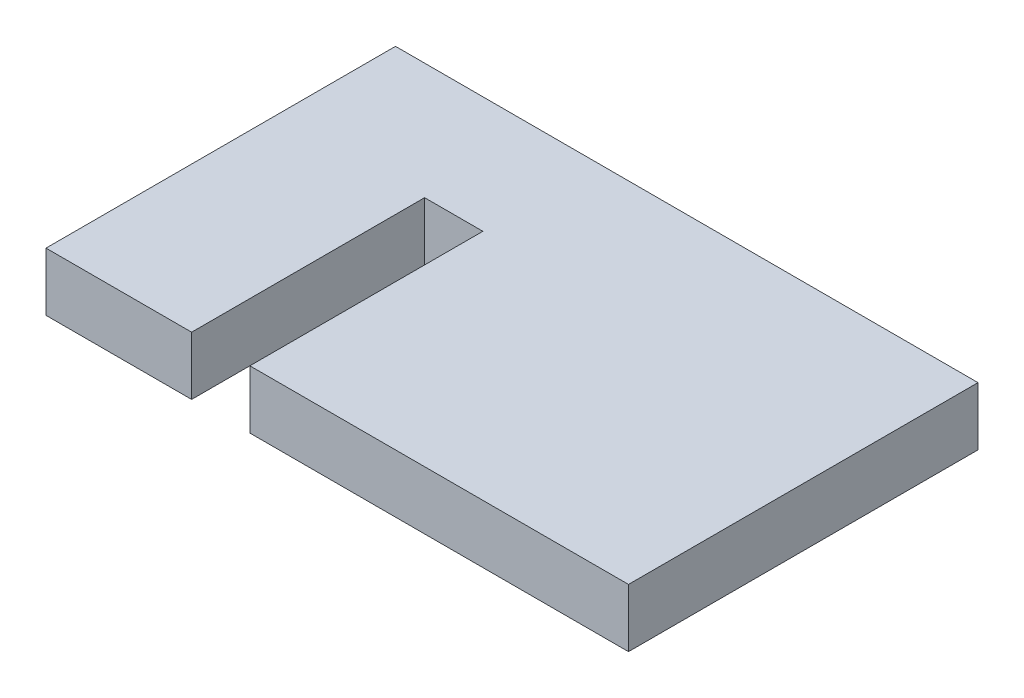
ISO-10303-21;
HEADER;
FILE_DESCRIPTION(('STEP AP214'),'2;1');
FILE_NAME('part.step','',(''),(''),'','','');
FILE_SCHEMA(('AUTOMOTIVE_DESIGN { 1 0 10303 214 1 1 1 1 }'));
ENDSEC;
DATA;
#1=APPLICATION_CONTEXT('core data for automotive mechanical design processes');
#2=APPLICATION_PROTOCOL_DEFINITION('international standard','automotive_design',2000,#1);
#3=PRODUCT_CONTEXT('',#1,'mechanical');
#4=PRODUCT('Part','Part','',(#3));
#5=PRODUCT_RELATED_PRODUCT_CATEGORY('part','',(#4));
#6=PRODUCT_DEFINITION_FORMATION('','',#4);
#7=PRODUCT_DEFINITION_CONTEXT('part definition',#1,'design');
#8=PRODUCT_DEFINITION('design','',#6,#7);
#9=PRODUCT_DEFINITION_SHAPE('','',#8);
#10=(LENGTH_UNIT() NAMED_UNIT(*) SI_UNIT(.MILLI.,.METRE.));
#11=(NAMED_UNIT(*) PLANE_ANGLE_UNIT() SI_UNIT($,.RADIAN.));
#12=(NAMED_UNIT(*) SI_UNIT($,.STERADIAN.) SOLID_ANGLE_UNIT());
#13=UNCERTAINTY_MEASURE_WITH_UNIT(LENGTH_MEASURE(1.E-05),#10,'distance_accuracy_value','');
#14=(GEOMETRIC_REPRESENTATION_CONTEXT(3) GLOBAL_UNCERTAINTY_ASSIGNED_CONTEXT((#13)) GLOBAL_UNIT_ASSIGNED_CONTEXT((#10,
#11,#12)) REPRESENTATION_CONTEXT('',''));
#15=CARTESIAN_POINT('',(0.,0.,0.));
#16=DIRECTION('',(0.,0.,1.));
#17=DIRECTION('',(1.,0.,0.));
#18=AXIS2_PLACEMENT_3D('',#15,#16,#17);
#19=CARTESIAN_POINT('',(0.,6.35,0.));
#20=DIRECTION('',(0.,0.,-1.));
#21=DIRECTION('',(-1.,0.,0.));
#22=AXIS2_PLACEMENT_3D('',#19,#20,#21);
#23=PLANE('',#22);
#24=DIRECTION('',(1.,0.,0.));
#25=VECTOR('',#24,1.);
#26=CARTESIAN_POINT('',(0.,0.,0.));
#27=LINE('',#26,#25);
#28=CARTESIAN_POINT('',(0.,0.,0.));
#29=VERTEX_POINT('',#28);
#30=CARTESIAN_POINT('',(15.875,0.,0.));
#31=VERTEX_POINT('',#30);
#32=EDGE_CURVE('E171',#29,#31,#27,.T.);
#33=ORIENTED_EDGE('',*,*,#32,.T.);
#34=DIRECTION('',(0.,-1.,0.));
#35=VECTOR('',#34,1.);
#36=CARTESIAN_POINT('',(15.875,6.35,0.));
#37=LINE('',#36,#35);
#38=CARTESIAN_POINT('',(15.875,6.35,0.));
#39=VERTEX_POINT('',#38);
#40=EDGE_CURVE('E145',#39,#31,#37,.T.);
#41=ORIENTED_EDGE('',*,*,#40,.F.);
#42=DIRECTION('',(1.,0.,0.));
#43=VECTOR('',#42,1.);
#44=CARTESIAN_POINT('',(0.,6.35,0.));
#45=LINE('',#44,#43);
#46=CARTESIAN_POINT('',(0.,6.35,0.));
#47=VERTEX_POINT('',#46);
#48=EDGE_CURVE('E92',#47,#39,#45,.T.);
#49=ORIENTED_EDGE('',*,*,#48,.F.);
#50=DIRECTION('',(0.,-1.,0.));
#51=VECTOR('',#50,1.);
#52=CARTESIAN_POINT('',(0.,6.35,0.));
#53=LINE('',#52,#51);
#54=EDGE_CURVE('E11',#47,#29,#53,.T.);
#55=ORIENTED_EDGE('',*,*,#54,.T.);
#56=EDGE_LOOP('',(#33,#41,#49,#55));
#57=FACE_BOUND('',#56,.T.);
#58=ADVANCED_FACE('F39',(#57),#23,.F.);
#59=CARTESIAN_POINT('',(0.,6.35,0.));
#60=DIRECTION('',(1.,0.,0.));
#61=DIRECTION('',(0.,0.,-1.));
#62=AXIS2_PLACEMENT_3D('',#59,#60,#61);
#63=PLANE('',#62);
#64=DIRECTION('',(0.,0.,1.));
#65=VECTOR('',#64,1.);
#66=CARTESIAN_POINT('',(0.,0.,0.));
#67=LINE('',#66,#65);
#68=CARTESIAN_POINT('',(0.,0.,-38.1));
#69=VERTEX_POINT('',#68);
#70=EDGE_CURVE('E148',#69,#29,#67,.T.);
#71=ORIENTED_EDGE('',*,*,#70,.T.);
#72=ORIENTED_EDGE('',*,*,#54,.F.);
#73=DIRECTION('',(0.,0.,1.));
#74=VECTOR('',#73,1.);
#75=CARTESIAN_POINT('',(0.,6.35,0.));
#76=LINE('',#75,#74);
#77=CARTESIAN_POINT('',(0.,6.35,-38.1));
#78=VERTEX_POINT('',#77);
#79=EDGE_CURVE('E155',#78,#47,#76,.T.);
#80=ORIENTED_EDGE('',*,*,#79,.F.);
#81=DIRECTION('',(0.,-1.,0.));
#82=VECTOR('',#81,1.);
#83=CARTESIAN_POINT('',(0.,6.35,-38.1));
#84=LINE('',#83,#82);
#85=EDGE_CURVE('E166',#78,#69,#84,.T.);
#86=ORIENTED_EDGE('',*,*,#85,.T.);
#87=EDGE_LOOP('',(#71,#72,#80,#86));
#88=FACE_BOUND('',#87,.T.);
#89=ADVANCED_FACE('F41',(#88),#63,.F.);
#90=CARTESIAN_POINT('',(22.225,6.35,0.));
#91=VERTEX_POINT('',#90);
#92=CARTESIAN_POINT('',(63.5,6.35,0.));
#93=VERTEX_POINT('',#92);
#94=EDGE_CURVE('E158',#91,#93,#45,.T.);
#95=ORIENTED_EDGE('',*,*,#94,.F.);
#96=DIRECTION('',(0.,-1.,0.));
#97=VECTOR('',#96,1.);
#98=CARTESIAN_POINT('',(22.225,6.35,0.));
#99=LINE('',#98,#97);
#100=CARTESIAN_POINT('',(22.225,0.,0.));
#101=VERTEX_POINT('',#100);
#102=EDGE_CURVE('E149',#91,#101,#99,.T.);
#103=ORIENTED_EDGE('',*,*,#102,.T.);
#104=CARTESIAN_POINT('',(63.5,0.,0.));
#105=VERTEX_POINT('',#104);
#106=EDGE_CURVE('E170',#101,#105,#27,.T.);
#107=ORIENTED_EDGE('',*,*,#106,.T.);
#108=DIRECTION('',(0.,-1.,0.));
#109=VECTOR('',#108,1.);
#110=CARTESIAN_POINT('',(63.5,6.35,0.));
#111=LINE('',#110,#109);
#112=EDGE_CURVE('E48',#93,#105,#111,.T.);
#113=ORIENTED_EDGE('',*,*,#112,.F.);
#114=EDGE_LOOP('',(#95,#103,#107,#113));
#115=FACE_BOUND('',#114,.T.);
#116=ADVANCED_FACE('F210',(#115),#23,.F.);
#117=CARTESIAN_POINT('',(63.5,6.35,0.));
#118=DIRECTION('',(-1.,0.,0.));
#119=DIRECTION('',(0.,0.,1.));
#120=AXIS2_PLACEMENT_3D('',#117,#118,#119);
#121=PLANE('',#120);
#122=DIRECTION('',(0.,0.,-1.));
#123=VECTOR('',#122,1.);
#124=CARTESIAN_POINT('',(63.5,0.,0.));
#125=LINE('',#124,#123);
#126=CARTESIAN_POINT('',(63.5,0.,-38.1));
#127=VERTEX_POINT('',#126);
#128=EDGE_CURVE('E175',#105,#127,#125,.T.);
#129=ORIENTED_EDGE('',*,*,#128,.T.);
#130=DIRECTION('',(0.,-1.,0.));
#131=VECTOR('',#130,1.);
#132=CARTESIAN_POINT('',(63.5,6.35,-38.1));
#133=LINE('',#132,#131);
#134=CARTESIAN_POINT('',(63.5,6.35,-38.1));
#135=VERTEX_POINT('',#134);
#136=EDGE_CURVE('E182',#135,#127,#133,.T.);
#137=ORIENTED_EDGE('',*,*,#136,.F.);
#138=DIRECTION('',(0.,0.,-1.));
#139=VECTOR('',#138,1.);
#140=CARTESIAN_POINT('',(63.5,6.35,0.));
#141=LINE('',#140,#139);
#142=EDGE_CURVE('E161',#93,#135,#141,.T.);
#143=ORIENTED_EDGE('',*,*,#142,.F.);
#144=ORIENTED_EDGE('',*,*,#112,.T.);
#145=EDGE_LOOP('',(#129,#137,#143,#144));
#146=FACE_BOUND('',#145,.T.);
#147=ADVANCED_FACE('F190',(#146),#121,.F.);
#148=CARTESIAN_POINT('',(0.,6.35,-38.1));
#149=DIRECTION('',(0.,0.,1.));
#150=DIRECTION('',(1.,0.,0.));
#151=AXIS2_PLACEMENT_3D('',#148,#149,#150);
#152=PLANE('',#151);
#153=DIRECTION('',(-1.,0.,0.));
#154=VECTOR('',#153,1.);
#155=CARTESIAN_POINT('',(0.,0.,-38.1));
#156=LINE('',#155,#154);
#157=EDGE_CURVE('E85',#127,#69,#156,.T.);
#158=ORIENTED_EDGE('',*,*,#157,.T.);
#159=ORIENTED_EDGE('',*,*,#85,.F.);
#160=DIRECTION('',(-1.,0.,0.));
#161=VECTOR('',#160,1.);
#162=CARTESIAN_POINT('',(0.,6.35,-38.1));
#163=LINE('',#162,#161);
#164=EDGE_CURVE('E64',#135,#78,#163,.T.);
#165=ORIENTED_EDGE('',*,*,#164,.F.);
#166=ORIENTED_EDGE('',*,*,#136,.T.);
#167=EDGE_LOOP('',(#158,#159,#165,#166));
#168=FACE_BOUND('',#167,.T.);
#169=ADVANCED_FACE('F202',(#168),#152,.F.);
#170=CARTESIAN_POINT('',(0.,6.35,0.));
#171=DIRECTION('',(0.,-1.,0.));
#172=DIRECTION('',(0.,0.,-1.));
#173=AXIS2_PLACEMENT_3D('',#170,#171,#172);
#174=PLANE('',#173);
#175=ORIENTED_EDGE('',*,*,#48,.T.);
#176=DIRECTION('',(0.,0.,-1.));
#177=VECTOR('',#176,1.);
#178=CARTESIAN_POINT('',(15.875,6.35,0.));
#179=LINE('',#178,#177);
#180=CARTESIAN_POINT('',(15.875,6.35,-25.4));
#181=VERTEX_POINT('',#180);
#182=EDGE_CURVE('E116',#39,#181,#179,.T.);
#183=ORIENTED_EDGE('',*,*,#182,.T.);
#184=DIRECTION('',(1.,0.,0.));
#185=VECTOR('',#184,1.);
#186=CARTESIAN_POINT('',(15.875,6.35,-25.4));
#187=LINE('',#186,#185);
#188=CARTESIAN_POINT('',(22.225,6.35,-25.4));
#189=VERTEX_POINT('',#188);
#190=EDGE_CURVE('E125',#181,#189,#187,.T.);
#191=ORIENTED_EDGE('',*,*,#190,.T.);
#192=DIRECTION('',(0.,0.,1.));
#193=VECTOR('',#192,1.);
#194=CARTESIAN_POINT('',(22.225,6.35,0.));
#195=LINE('',#194,#193);
#196=EDGE_CURVE('E122',#189,#91,#195,.T.);
#197=ORIENTED_EDGE('',*,*,#196,.T.);
#198=ORIENTED_EDGE('',*,*,#94,.T.);
#199=ORIENTED_EDGE('',*,*,#142,.T.);
#200=ORIENTED_EDGE('',*,*,#164,.T.);
#201=ORIENTED_EDGE('',*,*,#79,.T.);
#202=EDGE_LOOP('',(#175,#183,#191,#197,#198,#199,#200,#201));
#203=FACE_BOUND('',#202,.T.);
#204=ADVANCED_FACE('F131',(#203),#174,.F.);
#205=CARTESIAN_POINT('',(0.,0.,0.));
#206=DIRECTION('',(0.,-1.,0.));
#207=DIRECTION('',(0.,0.,-1.));
#208=AXIS2_PLACEMENT_3D('',#205,#206,#207);
#209=PLANE('',#208);
#210=DIRECTION('',(0.,0.,-1.));
#211=VECTOR('',#210,1.);
#212=CARTESIAN_POINT('',(15.875,0.,0.));
#213=LINE('',#212,#211);
#214=CARTESIAN_POINT('',(15.875,0.,-25.4));
#215=VERTEX_POINT('',#214);
#216=EDGE_CURVE('E55',#31,#215,#213,.T.);
#217=ORIENTED_EDGE('',*,*,#216,.F.);
#218=ORIENTED_EDGE('',*,*,#32,.F.);
#219=ORIENTED_EDGE('',*,*,#70,.F.);
#220=ORIENTED_EDGE('',*,*,#157,.F.);
#221=ORIENTED_EDGE('',*,*,#128,.F.);
#222=ORIENTED_EDGE('',*,*,#106,.F.);
#223=DIRECTION('',(0.,0.,1.));
#224=VECTOR('',#223,1.);
#225=CARTESIAN_POINT('',(22.225,0.,0.));
#226=LINE('',#225,#224);
#227=CARTESIAN_POINT('',(22.225,0.,-25.4));
#228=VERTEX_POINT('',#227);
#229=EDGE_CURVE('E133',#228,#101,#226,.T.);
#230=ORIENTED_EDGE('',*,*,#229,.F.);
#231=DIRECTION('',(1.,0.,0.));
#232=VECTOR('',#231,1.);
#233=CARTESIAN_POINT('',(15.875,0.,-25.4));
#234=LINE('',#233,#232);
#235=EDGE_CURVE('E136',#215,#228,#234,.T.);
#236=ORIENTED_EDGE('',*,*,#235,.F.);
#237=EDGE_LOOP('',(#217,#218,#219,#220,#221,#222,#230,#236));
#238=FACE_BOUND('',#237,.T.);
#239=ADVANCED_FACE('F196',(#238),#209,.T.);
#240=CARTESIAN_POINT('',(15.875,6.35,0.));
#241=DIRECTION('',(-1.,0.,0.));
#242=DIRECTION('',(0.,0.,1.));
#243=AXIS2_PLACEMENT_3D('',#240,#241,#242);
#244=PLANE('',#243);
#245=ORIENTED_EDGE('',*,*,#216,.T.);
#246=DIRECTION('',(0.,-1.,0.));
#247=VECTOR('',#246,1.);
#248=CARTESIAN_POINT('',(15.875,6.35,-25.4));
#249=LINE('',#248,#247);
#250=EDGE_CURVE('E112',#181,#215,#249,.T.);
#251=ORIENTED_EDGE('',*,*,#250,.F.);
#252=ORIENTED_EDGE('',*,*,#182,.F.);
#253=ORIENTED_EDGE('',*,*,#40,.T.);
#254=EDGE_LOOP('',(#245,#251,#252,#253));
#255=FACE_BOUND('',#254,.T.);
#256=ADVANCED_FACE('F114',(#255),#244,.F.);
#257=CARTESIAN_POINT('',(22.225,6.35,0.));
#258=DIRECTION('',(1.,0.,0.));
#259=DIRECTION('',(0.,0.,-1.));
#260=AXIS2_PLACEMENT_3D('',#257,#258,#259);
#261=PLANE('',#260);
#262=ORIENTED_EDGE('',*,*,#229,.T.);
#263=ORIENTED_EDGE('',*,*,#102,.F.);
#264=ORIENTED_EDGE('',*,*,#196,.F.);
#265=DIRECTION('',(0.,-1.,0.));
#266=VECTOR('',#265,1.);
#267=CARTESIAN_POINT('',(22.225,6.35,-25.4));
#268=LINE('',#267,#266);
#269=EDGE_CURVE('E121',#189,#228,#268,.T.);
#270=ORIENTED_EDGE('',*,*,#269,.T.);
#271=EDGE_LOOP('',(#262,#263,#264,#270));
#272=FACE_BOUND('',#271,.T.);
#273=ADVANCED_FACE('F223',(#272),#261,.F.);
#274=CARTESIAN_POINT('',(15.875,6.35,-25.4));
#275=DIRECTION('',(0.,0.,-1.));
#276=DIRECTION('',(-1.,0.,0.));
#277=AXIS2_PLACEMENT_3D('',#274,#275,#276);
#278=PLANE('',#277);
#279=ORIENTED_EDGE('',*,*,#235,.T.);
#280=ORIENTED_EDGE('',*,*,#269,.F.);
#281=ORIENTED_EDGE('',*,*,#190,.F.);
#282=ORIENTED_EDGE('',*,*,#250,.T.);
#283=EDGE_LOOP('',(#279,#280,#281,#282));
#284=FACE_BOUND('',#283,.T.);
#285=ADVANCED_FACE('F126',(#284),#278,.F.);
#286=CLOSED_SHELL('',(#58,#89,#116,#147,#169,#204,#239,#256,#273,#285));
#287=MANIFOLD_SOLID_BREP('B2',#286);
#288=ADVANCED_BREP_SHAPE_REPRESENTATION('',(#18,#287),#14);
#289=SHAPE_DEFINITION_REPRESENTATION(#9,#288);
ENDSEC;
END-ISO-10303-21;
